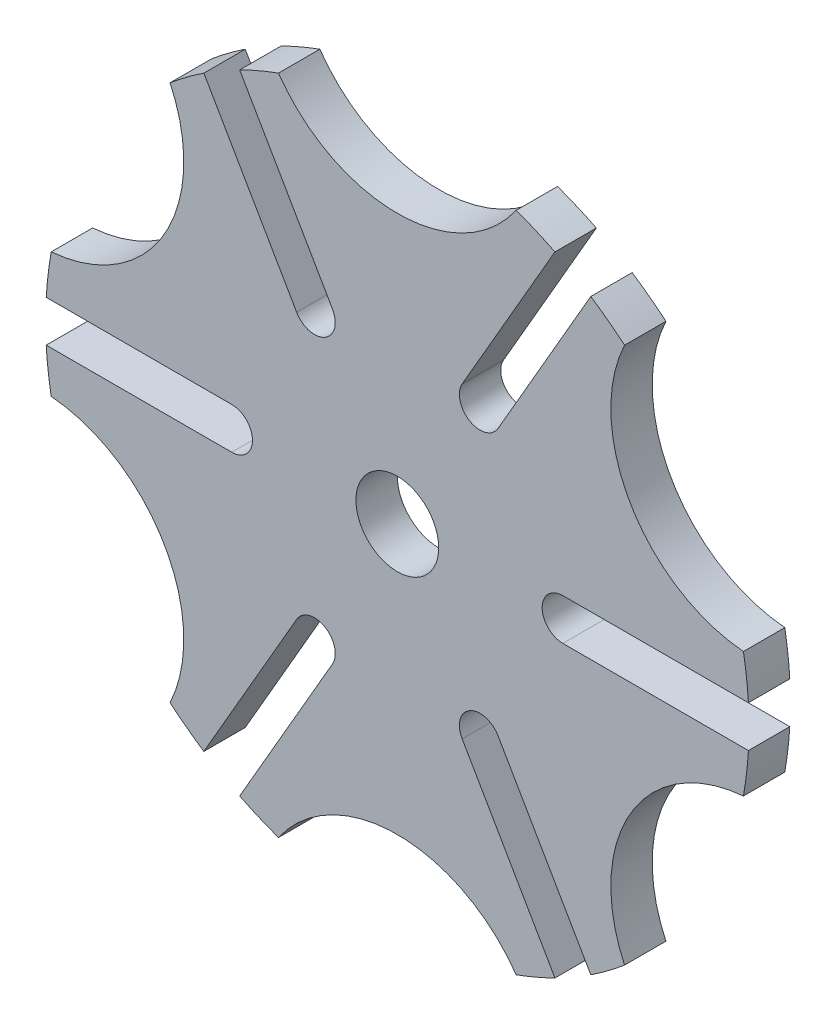
ISO-10303-21;
HEADER;
FILE_DESCRIPTION(('STEP AP214'),'2;1');
FILE_NAME('part.step','',(''),(''),'','','');
FILE_SCHEMA(('AUTOMOTIVE_DESIGN { 1 0 10303 214 1 1 1 1 }'));
ENDSEC;
DATA;
#1=APPLICATION_CONTEXT('core data for automotive mechanical design processes');
#2=APPLICATION_PROTOCOL_DEFINITION('international standard','automotive_design',2000,#1);
#3=PRODUCT_CONTEXT('',#1,'mechanical');
#4=PRODUCT('Part','Part','',(#3));
#5=PRODUCT_RELATED_PRODUCT_CATEGORY('part','',(#4));
#6=PRODUCT_DEFINITION_FORMATION('','',#4);
#7=PRODUCT_DEFINITION_CONTEXT('part definition',#1,'design');
#8=PRODUCT_DEFINITION('design','',#6,#7);
#9=PRODUCT_DEFINITION_SHAPE('','',#8);
#10=(LENGTH_UNIT() NAMED_UNIT(*) SI_UNIT(.MILLI.,.METRE.));
#11=(NAMED_UNIT(*) PLANE_ANGLE_UNIT() SI_UNIT($,.RADIAN.));
#12=(NAMED_UNIT(*) SI_UNIT($,.STERADIAN.) SOLID_ANGLE_UNIT());
#13=UNCERTAINTY_MEASURE_WITH_UNIT(LENGTH_MEASURE(1.E-05),#10,'distance_accuracy_value','');
#14=(GEOMETRIC_REPRESENTATION_CONTEXT(3) GLOBAL_UNCERTAINTY_ASSIGNED_CONTEXT((#13)) GLOBAL_UNIT_ASSIGNED_CONTEXT((#10,
#11,#12)) REPRESENTATION_CONTEXT('',''));
#15=CARTESIAN_POINT('',(0.,0.,0.));
#16=DIRECTION('',(0.,0.,1.));
#17=DIRECTION('',(1.,0.,0.));
#18=AXIS2_PLACEMENT_3D('',#15,#16,#17);
#19=CARTESIAN_POINT('',(0.,0.,10.));
#20=DIRECTION('',(0.,0.,-1.));
#21=DIRECTION('',(-1.,0.,0.));
#22=AXIS2_PLACEMENT_3D('',#19,#20,#21);
#23=CYLINDRICAL_SURFACE('',#22,85.);
#24=CARTESIAN_POINT('',(0.,0.,0.));
#25=DIRECTION('',(0.,0.,1.));
#26=DIRECTION('',(1.,0.,0.));
#27=AXIS2_PLACEMENT_3D('',#24,#25,#26);
#28=CIRCLE('',#27,85.);
#29=CARTESIAN_POINT('',(46.7565338901159,-70.9846922834948,0.));
#30=VERTEX_POINT('',#29);
#31=CARTESIAN_POINT('',(54.9206256864109,-64.8746859276648,0.));
#32=VERTEX_POINT('',#31);
#33=EDGE_CURVE('E287',#30,#32,#28,.T.);
#34=ORIENTED_EDGE('',*,*,#33,.T.);
#35=DIRECTION('',(0.,0.,1.));
#36=VECTOR('',#35,1.);
#37=CARTESIAN_POINT('',(54.9206256864109,-64.8746859276648,5.));
#38=LINE('',#37,#36);
#39=CARTESIAN_POINT('',(54.9206256864109,-64.8746859276648,10.));
#40=VERTEX_POINT('',#39);
#41=EDGE_CURVE('E48',#32,#40,#38,.T.);
#42=ORIENTED_EDGE('',*,*,#41,.T.);
#43=CARTESIAN_POINT('',(0.,0.,10.));
#44=DIRECTION('',(0.,0.,1.));
#45=DIRECTION('',(1.,0.,0.));
#46=AXIS2_PLACEMENT_3D('',#43,#44,#45);
#47=CIRCLE('',#46,85.);
#48=CARTESIAN_POINT('',(46.7565338901159,-70.9846922834948,10.));
#49=VERTEX_POINT('',#48);
#50=EDGE_CURVE('E306',#49,#40,#47,.T.);
#51=ORIENTED_EDGE('',*,*,#50,.F.);
#52=DIRECTION('',(0.,0.,-1.));
#53=VECTOR('',#52,1.);
#54=CARTESIAN_POINT('',(46.7565338901159,-70.9846922834948,10.));
#55=LINE('',#54,#53);
#56=EDGE_CURVE('E411',#49,#30,#55,.T.);
#57=ORIENTED_EDGE('',*,*,#56,.T.);
#58=EDGE_LOOP('',(#34,#42,#51,#57));
#59=FACE_BOUND('',#58,.T.);
#60=ADVANCED_FACE('F33',(#59),#23,.T.);
#61=CARTESIAN_POINT('',(-38.09627985227,-75.9846922834957,0.));
#62=VERTEX_POINT('',#61);
#63=CARTESIAN_POINT('',(-28.7228132326893,-80.0000000000003,0.));
#64=VERTEX_POINT('',#63);
#65=EDGE_CURVE('E292',#62,#64,#28,.T.);
#66=ORIENTED_EDGE('',*,*,#65,.T.);
#67=DIRECTION('',(0.,0.,1.));
#68=VECTOR('',#67,1.);
#69=CARTESIAN_POINT('',(-28.7228132326893,-80.0000000000003,5.));
#70=LINE('',#69,#68);
#71=CARTESIAN_POINT('',(-28.7228132326893,-80.0000000000003,10.));
#72=VERTEX_POINT('',#71);
#73=EDGE_CURVE('E56',#64,#72,#70,.T.);
#74=ORIENTED_EDGE('',*,*,#73,.T.);
#75=CARTESIAN_POINT('',(-38.09627985227,-75.9846922834957,10.));
#76=VERTEX_POINT('',#75);
#77=EDGE_CURVE('E553',#76,#72,#47,.T.);
#78=ORIENTED_EDGE('',*,*,#77,.F.);
#79=DIRECTION('',(0.,0.,-1.));
#80=VECTOR('',#79,1.);
#81=CARTESIAN_POINT('',(-38.09627985227,-75.9846922834957,10.));
#82=LINE('',#81,#80);
#83=EDGE_CURVE('E335',#76,#62,#82,.T.);
#84=ORIENTED_EDGE('',*,*,#83,.T.);
#85=EDGE_LOOP('',(#66,#74,#78,#84));
#86=FACE_BOUND('',#85,.T.);
#87=ADVANCED_FACE('F332',(#86),#23,.T.);
#88=CARTESIAN_POINT('',(-84.8528137423857,-5.,0.));
#89=VERTEX_POINT('',#88);
#90=CARTESIAN_POINT('',(-83.6434389191002,-15.1253140723346,0.));
#91=VERTEX_POINT('',#90);
#92=EDGE_CURVE('E318',#89,#91,#28,.T.);
#93=ORIENTED_EDGE('',*,*,#92,.T.);
#94=DIRECTION('',(0.,0.,1.));
#95=VECTOR('',#94,1.);
#96=CARTESIAN_POINT('',(-83.6434389191002,-15.1253140723346,5.));
#97=LINE('',#96,#95);
#98=CARTESIAN_POINT('',(-83.6434389191002,-15.1253140723346,10.));
#99=VERTEX_POINT('',#98);
#100=EDGE_CURVE('E358',#91,#99,#97,.T.);
#101=ORIENTED_EDGE('',*,*,#100,.T.);
#102=CARTESIAN_POINT('',(-84.8528137423857,-5.,10.));
#103=VERTEX_POINT('',#102);
#104=EDGE_CURVE('E547',#103,#99,#47,.T.);
#105=ORIENTED_EDGE('',*,*,#104,.F.);
#106=DIRECTION('',(0.,0.,-1.));
#107=VECTOR('',#106,1.);
#108=CARTESIAN_POINT('',(-84.8528137423857,-5.,10.));
#109=LINE('',#108,#107);
#110=EDGE_CURVE('E458',#103,#89,#109,.T.);
#111=ORIENTED_EDGE('',*,*,#110,.T.);
#112=EDGE_LOOP('',(#93,#101,#105,#111));
#113=FACE_BOUND('',#112,.T.);
#114=ADVANCED_FACE('F595',(#113),#23,.T.);
#115=CARTESIAN_POINT('',(-46.7565338901154,70.9846922834952,0.));
#116=VERTEX_POINT('',#115);
#117=CARTESIAN_POINT('',(-54.9206256864104,64.8746859276652,0.));
#118=VERTEX_POINT('',#117);
#119=EDGE_CURVE('E311',#116,#118,#28,.T.);
#120=ORIENTED_EDGE('',*,*,#119,.T.);
#121=DIRECTION('',(0.,0.,1.));
#122=VECTOR('',#121,1.);
#123=CARTESIAN_POINT('',(-54.9206256864104,64.8746859276652,5.));
#124=LINE('',#123,#122);
#125=CARTESIAN_POINT('',(-54.9206256864104,64.8746859276652,10.));
#126=VERTEX_POINT('',#125);
#127=EDGE_CURVE('E368',#118,#126,#124,.T.);
#128=ORIENTED_EDGE('',*,*,#127,.T.);
#129=CARTESIAN_POINT('',(-46.7565338901154,70.9846922834952,10.));
#130=VERTEX_POINT('',#129);
#131=EDGE_CURVE('E541',#130,#126,#47,.T.);
#132=ORIENTED_EDGE('',*,*,#131,.F.);
#133=DIRECTION('',(0.,0.,-1.));
#134=VECTOR('',#133,1.);
#135=CARTESIAN_POINT('',(-46.7565338901154,70.9846922834952,10.));
#136=LINE('',#135,#134);
#137=EDGE_CURVE('E482',#130,#116,#136,.T.);
#138=ORIENTED_EDGE('',*,*,#137,.T.);
#139=EDGE_LOOP('',(#120,#128,#132,#138));
#140=FACE_BOUND('',#139,.T.);
#141=ADVANCED_FACE('F637',(#140),#23,.T.);
#142=CARTESIAN_POINT('',(38.0962798522705,75.9846922834954,0.));
#143=VERTEX_POINT('',#142);
#144=CARTESIAN_POINT('',(28.7228132326898,80.0000000000001,0.));
#145=VERTEX_POINT('',#144);
#146=EDGE_CURVE('E301',#143,#145,#28,.T.);
#147=ORIENTED_EDGE('',*,*,#146,.T.);
#148=DIRECTION('',(0.,0.,1.));
#149=VECTOR('',#148,1.);
#150=CARTESIAN_POINT('',(28.7228132326899,80.0000000000001,5.));
#151=LINE('',#150,#149);
#152=CARTESIAN_POINT('',(28.7228132326899,80.0000000000001,10.));
#153=VERTEX_POINT('',#152);
#154=EDGE_CURVE('E378',#145,#153,#151,.T.);
#155=ORIENTED_EDGE('',*,*,#154,.T.);
#156=CARTESIAN_POINT('',(38.0962798522705,75.9846922834954,10.));
#157=VERTEX_POINT('',#156);
#158=EDGE_CURVE('E532',#157,#153,#47,.T.);
#159=ORIENTED_EDGE('',*,*,#158,.F.);
#160=DIRECTION('',(0.,0.,-1.));
#161=VECTOR('',#160,1.);
#162=CARTESIAN_POINT('',(38.0962798522705,75.9846922834954,10.));
#163=LINE('',#162,#161);
#164=EDGE_CURVE('E506',#157,#143,#163,.T.);
#165=ORIENTED_EDGE('',*,*,#164,.T.);
#166=EDGE_LOOP('',(#147,#155,#159,#165));
#167=FACE_BOUND('',#166,.T.);
#168=ADVANCED_FACE('F618',(#167),#23,.T.);
#169=CARTESIAN_POINT('',(84.8528137423857,5.,0.));
#170=VERTEX_POINT('',#169);
#171=CARTESIAN_POINT('',(83.6434389191002,15.1253140723346,0.));
#172=VERTEX_POINT('',#171);
#173=EDGE_CURVE('E291',#170,#172,#28,.T.);
#174=ORIENTED_EDGE('',*,*,#173,.T.);
#175=DIRECTION('',(0.,0.,1.));
#176=VECTOR('',#175,1.);
#177=CARTESIAN_POINT('',(83.6434389191002,15.1253140723346,5.));
#178=LINE('',#177,#176);
#179=CARTESIAN_POINT('',(83.6434389191002,15.1253140723346,10.));
#180=VERTEX_POINT('',#179);
#181=EDGE_CURVE('E388',#172,#180,#178,.T.);
#182=ORIENTED_EDGE('',*,*,#181,.T.);
#183=CARTESIAN_POINT('',(84.8528137423857,5.,10.));
#184=VERTEX_POINT('',#183);
#185=EDGE_CURVE('E308',#184,#180,#47,.T.);
#186=ORIENTED_EDGE('',*,*,#185,.F.);
#187=DIRECTION('',(0.,0.,-1.));
#188=VECTOR('',#187,1.);
#189=CARTESIAN_POINT('',(84.8528137423857,5.,10.));
#190=LINE('',#189,#188);
#191=EDGE_CURVE('E526',#184,#170,#190,.T.);
#192=ORIENTED_EDGE('',*,*,#191,.T.);
#193=EDGE_LOOP('',(#174,#182,#186,#192));
#194=FACE_BOUND('',#193,.T.);
#195=ADVANCED_FACE('F846',(#194),#23,.T.);
#196=CARTESIAN_POINT('',(83.6434389191004,-15.1253140723334,10.));
#197=VERTEX_POINT('',#196);
#198=CARTESIAN_POINT('',(84.8528137423857,-5.,10.));
#199=VERTEX_POINT('',#198);
#200=EDGE_CURVE('E280',#197,#199,#47,.T.);
#201=ORIENTED_EDGE('',*,*,#200,.F.);
#202=DIRECTION('',(0.,0.,1.));
#203=VECTOR('',#202,1.);
#204=CARTESIAN_POINT('',(83.6434389191004,-15.1253140723334,5.));
#205=LINE('',#204,#203);
#206=CARTESIAN_POINT('',(83.6434389191004,-15.1253140723334,0.));
#207=VERTEX_POINT('',#206);
#208=EDGE_CURVE('E266',#197,#207,#205,.F.);
#209=ORIENTED_EDGE('',*,*,#208,.T.);
#210=CARTESIAN_POINT('',(84.8528137423857,-5.,0.));
#211=VERTEX_POINT('',#210);
#212=EDGE_CURVE('E278',#207,#211,#28,.T.);
#213=ORIENTED_EDGE('',*,*,#212,.T.);
#214=DIRECTION('',(0.,0.,-1.));
#215=VECTOR('',#214,1.);
#216=CARTESIAN_POINT('',(84.8528137423857,-5.,10.));
#217=LINE('',#216,#215);
#218=EDGE_CURVE('E523',#211,#199,#217,.F.);
#219=ORIENTED_EDGE('',*,*,#218,.T.);
#220=EDGE_LOOP('',(#201,#209,#213,#219));
#221=FACE_BOUND('',#220,.T.);
#222=ADVANCED_FACE('F276',(#221),#23,.T.);
#223=CARTESIAN_POINT('',(28.722813232691,-79.9999999999997,10.));
#224=VERTEX_POINT('',#223);
#225=CARTESIAN_POINT('',(38.0962798522716,-75.9846922834949,10.));
#226=VERTEX_POINT('',#225);
#227=EDGE_CURVE('E307',#224,#226,#47,.T.);
#228=ORIENTED_EDGE('',*,*,#227,.F.);
#229=DIRECTION('',(0.,0.,1.));
#230=VECTOR('',#229,1.);
#231=CARTESIAN_POINT('',(28.722813232691,-79.9999999999997,5.));
#232=LINE('',#231,#230);
#233=CARTESIAN_POINT('',(28.722813232691,-79.9999999999997,0.));
#234=VERTEX_POINT('',#233);
#235=EDGE_CURVE('E342',#224,#234,#232,.F.);
#236=ORIENTED_EDGE('',*,*,#235,.T.);
#237=CARTESIAN_POINT('',(38.0962798522716,-75.9846922834949,0.));
#238=VERTEX_POINT('',#237);
#239=EDGE_CURVE('E290',#234,#238,#28,.T.);
#240=ORIENTED_EDGE('',*,*,#239,.T.);
#241=DIRECTION('',(0.,0.,-1.));
#242=VECTOR('',#241,1.);
#243=CARTESIAN_POINT('',(38.0962798522716,-75.9846922834949,10.));
#244=LINE('',#243,#242);
#245=EDGE_CURVE('E407',#238,#226,#244,.F.);
#246=ORIENTED_EDGE('',*,*,#245,.T.);
#247=EDGE_LOOP('',(#228,#236,#240,#246));
#248=FACE_BOUND('',#247,.T.);
#249=ADVANCED_FACE('F578',(#248),#23,.T.);
#250=CARTESIAN_POINT('',(-54.9206256864099,-64.8746859276656,10.));
#251=VERTEX_POINT('',#250);
#252=CARTESIAN_POINT('',(-46.7565338901144,-70.9846922834958,10.));
#253=VERTEX_POINT('',#252);
#254=EDGE_CURVE('E551',#251,#253,#47,.T.);
#255=ORIENTED_EDGE('',*,*,#254,.F.);
#256=DIRECTION('',(0.,0.,1.));
#257=VECTOR('',#256,1.);
#258=CARTESIAN_POINT('',(-54.9206256864099,-64.8746859276656,5.));
#259=LINE('',#258,#257);
#260=CARTESIAN_POINT('',(-54.9206256864099,-64.8746859276656,0.));
#261=VERTEX_POINT('',#260);
#262=EDGE_CURVE('E354',#251,#261,#259,.F.);
#263=ORIENTED_EDGE('',*,*,#262,.T.);
#264=CARTESIAN_POINT('',(-46.7565338901144,-70.9846922834958,0.));
#265=VERTEX_POINT('',#264);
#266=EDGE_CURVE('E299',#261,#265,#28,.T.);
#267=ORIENTED_EDGE('',*,*,#266,.T.);
#268=DIRECTION('',(0.,0.,-1.));
#269=VECTOR('',#268,1.);
#270=CARTESIAN_POINT('',(-46.7565338901144,-70.9846922834958,10.));
#271=LINE('',#270,#269);
#272=EDGE_CURVE('E431',#265,#253,#271,.F.);
#273=ORIENTED_EDGE('',*,*,#272,.T.);
#274=EDGE_LOOP('',(#255,#263,#267,#273));
#275=FACE_BOUND('',#274,.T.);
#276=ADVANCED_FACE('F658',(#275),#23,.T.);
#277=CARTESIAN_POINT('',(-83.6434389191003,15.125314072334,10.));
#278=VERTEX_POINT('',#277);
#279=CARTESIAN_POINT('',(-84.8528137423857,5.,10.));
#280=VERTEX_POINT('',#279);
#281=EDGE_CURVE('E545',#278,#280,#47,.T.);
#282=ORIENTED_EDGE('',*,*,#281,.F.);
#283=DIRECTION('',(0.,0.,1.));
#284=VECTOR('',#283,1.);
#285=CARTESIAN_POINT('',(-83.6434389191003,15.125314072334,5.));
#286=LINE('',#285,#284);
#287=CARTESIAN_POINT('',(-83.6434389191003,15.125314072334,0.));
#288=VERTEX_POINT('',#287);
#289=EDGE_CURVE('E364',#278,#288,#286,.F.);
#290=ORIENTED_EDGE('',*,*,#289,.T.);
#291=CARTESIAN_POINT('',(-84.8528137423857,5.,0.));
#292=VERTEX_POINT('',#291);
#293=EDGE_CURVE('E316',#288,#292,#28,.T.);
#294=ORIENTED_EDGE('',*,*,#293,.T.);
#295=DIRECTION('',(0.,0.,-1.));
#296=VECTOR('',#295,1.);
#297=CARTESIAN_POINT('',(-84.8528137423857,5.,10.));
#298=LINE('',#297,#296);
#299=EDGE_CURVE('E454',#292,#280,#298,.F.);
#300=ORIENTED_EDGE('',*,*,#299,.T.);
#301=EDGE_LOOP('',(#282,#290,#294,#300));
#302=FACE_BOUND('',#301,.T.);
#303=ADVANCED_FACE('F604',(#302),#23,.T.);
#304=CARTESIAN_POINT('',(-28.7228132326905,79.9999999999999,10.));
#305=VERTEX_POINT('',#304);
#306=CARTESIAN_POINT('',(-38.096279852271,75.9846922834952,10.));
#307=VERTEX_POINT('',#306);
#308=EDGE_CURVE('E539',#305,#307,#47,.T.);
#309=ORIENTED_EDGE('',*,*,#308,.F.);
#310=DIRECTION('',(0.,0.,1.));
#311=VECTOR('',#310,1.);
#312=CARTESIAN_POINT('',(-28.7228132326905,79.9999999999999,5.));
#313=LINE('',#312,#311);
#314=CARTESIAN_POINT('',(-28.7228132326905,79.9999999999999,0.));
#315=VERTEX_POINT('',#314);
#316=EDGE_CURVE('E374',#305,#315,#313,.F.);
#317=ORIENTED_EDGE('',*,*,#316,.T.);
#318=CARTESIAN_POINT('',(-38.096279852271,75.9846922834952,0.));
#319=VERTEX_POINT('',#318);
#320=EDGE_CURVE('E309',#315,#319,#28,.T.);
#321=ORIENTED_EDGE('',*,*,#320,.T.);
#322=DIRECTION('',(0.,0.,-1.));
#323=VECTOR('',#322,1.);
#324=CARTESIAN_POINT('',(-38.096279852271,75.9846922834952,10.));
#325=LINE('',#324,#323);
#326=EDGE_CURVE('E478',#319,#307,#325,.F.);
#327=ORIENTED_EDGE('',*,*,#326,.T.);
#328=EDGE_LOOP('',(#309,#317,#321,#327));
#329=FACE_BOUND('',#328,.T.);
#330=ADVANCED_FACE('F597',(#329),#23,.T.);
#331=CARTESIAN_POINT('',(54.9206256864099,64.8746859276656,10.));
#332=VERTEX_POINT('',#331);
#333=CARTESIAN_POINT('',(46.7565338901149,70.9846922834955,10.));
#334=VERTEX_POINT('',#333);
#335=EDGE_CURVE('E531',#332,#334,#47,.T.);
#336=ORIENTED_EDGE('',*,*,#335,.F.);
#337=DIRECTION('',(0.,0.,1.));
#338=VECTOR('',#337,1.);
#339=CARTESIAN_POINT('',(54.9206256864099,64.8746859276656,5.));
#340=LINE('',#339,#338);
#341=CARTESIAN_POINT('',(54.9206256864099,64.8746859276656,0.));
#342=VERTEX_POINT('',#341);
#343=EDGE_CURVE('E384',#332,#342,#340,.F.);
#344=ORIENTED_EDGE('',*,*,#343,.T.);
#345=CARTESIAN_POINT('',(46.7565338901149,70.9846922834955,0.));
#346=VERTEX_POINT('',#345);
#347=EDGE_CURVE('E293',#342,#346,#28,.T.);
#348=ORIENTED_EDGE('',*,*,#347,.T.);
#349=DIRECTION('',(0.,0.,-1.));
#350=VECTOR('',#349,1.);
#351=CARTESIAN_POINT('',(46.7565338901149,70.9846922834955,10.));
#352=LINE('',#351,#350);
#353=EDGE_CURVE('E502',#346,#334,#352,.F.);
#354=ORIENTED_EDGE('',*,*,#353,.T.);
#355=EDGE_LOOP('',(#336,#344,#348,#354));
#356=FACE_BOUND('',#355,.T.);
#357=ADVANCED_FACE('F35',(#356),#23,.T.);
#358=CARTESIAN_POINT('',(0.,0.,10.));
#359=DIRECTION('',(0.,0.,1.));
#360=DIRECTION('',(1.,0.,0.));
#361=AXIS2_PLACEMENT_3D('',#358,#359,#360);
#362=PLANE('',#361);
#363=CARTESIAN_POINT('',(86.6025403784445,-49.9999999999989,10.));
#364=DIRECTION('',(0.,0.,1.));
#365=DIRECTION('',(0.50000000000001,-0.866025403784433,0.));
#366=AXIS2_PLACEMENT_3D('',#363,#364,#365);
#367=CIRCLE('',#366,35.);
#368=EDGE_CURVE('E272',#197,#40,#367,.T.);
#369=ORIENTED_EDGE('',*,*,#368,.F.);
#370=ORIENTED_EDGE('',*,*,#200,.T.);
#371=DIRECTION('',(1.,0.,0.));
#372=VECTOR('',#371,1.);
#373=CARTESIAN_POINT('',(40.,-5.,10.));
#374=LINE('',#373,#372);
#375=CARTESIAN_POINT('',(40.,-5.,10.));
#376=VERTEX_POINT('',#375);
#377=EDGE_CURVE('E516',#376,#199,#374,.T.);
#378=ORIENTED_EDGE('',*,*,#377,.F.);
#379=CARTESIAN_POINT('',(40.,0.,10.));
#380=DIRECTION('',(0.,0.,1.));
#381=DIRECTION('',(1.,0.,0.));
#382=AXIS2_PLACEMENT_3D('',#379,#380,#381);
#383=CIRCLE('',#382,5.);
#384=CARTESIAN_POINT('',(40.,5.,10.));
#385=VERTEX_POINT('',#384);
#386=EDGE_CURVE('E508',#385,#376,#383,.T.);
#387=ORIENTED_EDGE('',*,*,#386,.F.);
#388=DIRECTION('',(-1.,0.,0.));
#389=VECTOR('',#388,1.);
#390=CARTESIAN_POINT('',(40.,5.,10.));
#391=LINE('',#390,#389);
#392=EDGE_CURVE('E511',#184,#385,#391,.T.);
#393=ORIENTED_EDGE('',*,*,#392,.F.);
#394=ORIENTED_EDGE('',*,*,#185,.T.);
#395=CARTESIAN_POINT('',(86.6025403784438,50.0000000000001,10.));
#396=DIRECTION('',(0.,0.,1.));
#397=DIRECTION('',(1.,0.,0.));
#398=AXIS2_PLACEMENT_3D('',#395,#396,#397);
#399=CIRCLE('',#398,35.);
#400=EDGE_CURVE('E380',#332,#180,#399,.T.);
#401=ORIENTED_EDGE('',*,*,#400,.F.);
#402=ORIENTED_EDGE('',*,*,#335,.T.);
#403=DIRECTION('',(0.499999999999998,0.86602540378444,0.));
#404=VECTOR('',#403,1.);
#405=CARTESIAN_POINT('',(24.3301270189221,32.1410161513776,10.));
#406=LINE('',#405,#404);
#407=CARTESIAN_POINT('',(24.3301270189221,32.1410161513776,10.));
#408=VERTEX_POINT('',#407);
#409=EDGE_CURVE('E495',#408,#334,#406,.T.);
#410=ORIENTED_EDGE('',*,*,#409,.F.);
#411=CARTESIAN_POINT('',(19.9999999999999,34.6410161513776,10.));
#412=DIRECTION('',(0.,0.,1.));
#413=DIRECTION('',(0.499999999999998,0.86602540378444,0.));
#414=AXIS2_PLACEMENT_3D('',#411,#412,#413);
#415=CIRCLE('',#414,5.);
#416=CARTESIAN_POINT('',(15.6698729810777,37.1410161513776,10.));
#417=VERTEX_POINT('',#416);
#418=EDGE_CURVE('E484',#417,#408,#415,.T.);
#419=ORIENTED_EDGE('',*,*,#418,.F.);
#420=DIRECTION('',(-0.499999999999998,-0.86602540378444,0.));
#421=VECTOR('',#420,1.);
#422=CARTESIAN_POINT('',(15.6698729810777,37.1410161513776,10.));
#423=LINE('',#422,#421);
#424=EDGE_CURVE('E489',#157,#417,#423,.T.);
#425=ORIENTED_EDGE('',*,*,#424,.F.);
#426=ORIENTED_EDGE('',*,*,#158,.T.);
#427=CARTESIAN_POINT('',(-3.7470027081099E-13,100.,10.));
#428=DIRECTION('',(0.,0.,1.));
#429=DIRECTION('',(0.499999999999998,0.86602540378444,0.));
#430=AXIS2_PLACEMENT_3D('',#427,#428,#429);
#431=CIRCLE('',#430,35.);
#432=EDGE_CURVE('E370',#305,#153,#431,.T.);
#433=ORIENTED_EDGE('',*,*,#432,.F.);
#434=ORIENTED_EDGE('',*,*,#308,.T.);
#435=DIRECTION('',(-0.500000000000004,0.866025403784436,0.));
#436=VECTOR('',#435,1.);
#437=CARTESIAN_POINT('',(-15.669872981078,37.1410161513775,10.));
#438=LINE('',#437,#436);
#439=CARTESIAN_POINT('',(-15.669872981078,37.1410161513775,10.));
#440=VERTEX_POINT('',#439);
#441=EDGE_CURVE('E471',#440,#307,#438,.T.);
#442=ORIENTED_EDGE('',*,*,#441,.F.);
#443=CARTESIAN_POINT('',(-20.0000000000002,34.6410161513775,10.));
#444=DIRECTION('',(0.,0.,1.));
#445=DIRECTION('',(-0.500000000000004,0.866025403784436,0.));
#446=AXIS2_PLACEMENT_3D('',#443,#444,#445);
#447=CIRCLE('',#446,5.);
#448=CARTESIAN_POINT('',(-24.3301270189223,32.1410161513774,10.));
#449=VERTEX_POINT('',#448);
#450=EDGE_CURVE('E460',#449,#440,#447,.T.);
#451=ORIENTED_EDGE('',*,*,#450,.F.);
#452=DIRECTION('',(0.500000000000004,-0.866025403784436,0.));
#453=VECTOR('',#452,1.);
#454=CARTESIAN_POINT('',(-24.3301270189223,32.1410161513774,10.));
#455=LINE('',#454,#453);
#456=EDGE_CURVE('E465',#130,#449,#455,.T.);
#457=ORIENTED_EDGE('',*,*,#456,.F.);
#458=ORIENTED_EDGE('',*,*,#131,.T.);
#459=CARTESIAN_POINT('',(-86.6025403784442,49.9999999999995,10.));
#460=DIRECTION('',(0.,0.,1.));
#461=DIRECTION('',(-0.500000000000004,0.866025403784436,0.));
#462=AXIS2_PLACEMENT_3D('',#459,#460,#461);
#463=CIRCLE('',#462,35.);
#464=EDGE_CURVE('E360',#278,#126,#463,.T.);
#465=ORIENTED_EDGE('',*,*,#464,.F.);
#466=ORIENTED_EDGE('',*,*,#281,.T.);
#467=DIRECTION('',(-1.,0.,0.));
#468=VECTOR('',#467,1.);
#469=CARTESIAN_POINT('',(-40.,5.,10.));
#470=LINE('',#469,#468);
#471=CARTESIAN_POINT('',(-40.,5.,10.));
#472=VERTEX_POINT('',#471);
#473=EDGE_CURVE('E447',#472,#280,#470,.T.);
#474=ORIENTED_EDGE('',*,*,#473,.F.);
#475=CARTESIAN_POINT('',(-40.,0.,10.));
#476=DIRECTION('',(0.,0.,1.));
#477=DIRECTION('',(-1.,0.,0.));
#478=AXIS2_PLACEMENT_3D('',#475,#476,#477);
#479=CIRCLE('',#478,5.);
#480=CARTESIAN_POINT('',(-40.,-5.,10.));
#481=VERTEX_POINT('',#480);
#482=EDGE_CURVE('E436',#481,#472,#479,.T.);
#483=ORIENTED_EDGE('',*,*,#482,.F.);
#484=DIRECTION('',(1.,0.,0.));
#485=VECTOR('',#484,1.);
#486=CARTESIAN_POINT('',(-40.,-5.,10.));
#487=LINE('',#486,#485);
#488=EDGE_CURVE('E441',#103,#481,#487,.T.);
#489=ORIENTED_EDGE('',*,*,#488,.F.);
#490=ORIENTED_EDGE('',*,*,#104,.T.);
#491=CARTESIAN_POINT('',(-86.6025403784438,-50.0000000000001,10.));
#492=DIRECTION('',(0.,0.,1.));
#493=DIRECTION('',(-1.,0.,0.));
#494=AXIS2_PLACEMENT_3D('',#491,#492,#493);
#495=CIRCLE('',#494,35.);
#496=EDGE_CURVE('E350',#251,#99,#495,.T.);
#497=ORIENTED_EDGE('',*,*,#496,.F.);
#498=ORIENTED_EDGE('',*,*,#254,.T.);
#499=DIRECTION('',(-0.499999999999992,-0.866025403784443,0.));
#500=VECTOR('',#499,1.);
#501=CARTESIAN_POINT('',(-24.3301270189219,-32.1410161513778,10.));
#502=LINE('',#501,#500);
#503=CARTESIAN_POINT('',(-24.3301270189219,-32.1410161513778,10.));
#504=VERTEX_POINT('',#503);
#505=EDGE_CURVE('E424',#504,#253,#502,.T.);
#506=ORIENTED_EDGE('',*,*,#505,.F.);
#507=CARTESIAN_POINT('',(-19.9999999999997,-34.6410161513777,10.));
#508=DIRECTION('',(0.,0.,1.));
#509=DIRECTION('',(-0.499999999999992,-0.866025403784443,0.));
#510=AXIS2_PLACEMENT_3D('',#507,#508,#509);
#511=CIRCLE('',#510,5.);
#512=CARTESIAN_POINT('',(-15.6698729810775,-37.1410161513777,10.));
#513=VERTEX_POINT('',#512);
#514=EDGE_CURVE('E414',#513,#504,#511,.T.);
#515=ORIENTED_EDGE('',*,*,#514,.F.);
#516=DIRECTION('',(0.499999999999992,0.866025403784443,0.));
#517=VECTOR('',#516,1.);
#518=CARTESIAN_POINT('',(-15.6698729810775,-37.1410161513777,10.));
#519=LINE('',#518,#517);
#520=EDGE_CURVE('E418',#76,#513,#519,.T.);
#521=ORIENTED_EDGE('',*,*,#520,.F.);
#522=ORIENTED_EDGE('',*,*,#77,.T.);
#523=CARTESIAN_POINT('',(1.06858966120171E-12,-100.,10.));
#524=DIRECTION('',(0.,0.,1.));
#525=DIRECTION('',(-0.499999999999992,-0.866025403784443,0.));
#526=AXIS2_PLACEMENT_3D('',#523,#524,#525);
#527=CIRCLE('',#526,35.);
#528=EDGE_CURVE('E343',#224,#72,#527,.T.);
#529=ORIENTED_EDGE('',*,*,#528,.F.);
#530=ORIENTED_EDGE('',*,*,#227,.T.);
#531=DIRECTION('',(0.50000000000001,-0.866025403784433,0.));
#532=VECTOR('',#531,1.);
#533=CARTESIAN_POINT('',(15.6698729810782,-37.1410161513774,10.));
#534=LINE('',#533,#532);
#535=CARTESIAN_POINT('',(15.6698729810782,-37.1410161513774,10.));
#536=VERTEX_POINT('',#535);
#537=EDGE_CURVE('E400',#536,#226,#534,.T.);
#538=ORIENTED_EDGE('',*,*,#537,.F.);
#539=CARTESIAN_POINT('',(20.0000000000004,-34.6410161513773,10.));
#540=DIRECTION('',(0.,0.,1.));
#541=DIRECTION('',(0.50000000000001,-0.866025403784433,0.));
#542=AXIS2_PLACEMENT_3D('',#539,#540,#541);
#543=CIRCLE('',#542,5.);
#544=CARTESIAN_POINT('',(24.3301270189226,-32.1410161513773,10.));
#545=VERTEX_POINT('',#544);
#546=EDGE_CURVE('E390',#545,#536,#543,.T.);
#547=ORIENTED_EDGE('',*,*,#546,.F.);
#548=DIRECTION('',(-0.50000000000001,0.866025403784433,0.));
#549=VECTOR('',#548,1.);
#550=CARTESIAN_POINT('',(24.3301270189226,-32.1410161513773,10.));
#551=LINE('',#550,#549);
#552=EDGE_CURVE('E395',#49,#545,#551,.T.);
#553=ORIENTED_EDGE('',*,*,#552,.F.);
#554=ORIENTED_EDGE('',*,*,#50,.T.);
#555=EDGE_LOOP('',(#369,#370,#378,#387,#393,#394,#401,#402,#410,#419,#425,#426,#433,#434,#442,
#451,#457,#458,#465,#466,#474,#483,#489,#490,#497,#498,#506,#515,#521,#522,#529,#530,#538,#547,
#553,#554));
#556=FACE_BOUND('',#555,.T.);
#557=CARTESIAN_POINT('',(0.,0.,10.));
#558=DIRECTION('',(0.,0.,1.));
#559=DIRECTION('',(1.,0.,0.));
#560=AXIS2_PLACEMENT_3D('',#557,#558,#559);
#561=CIRCLE('',#560,10.);
#562=CARTESIAN_POINT('',(10.,0.,10.));
#563=VERTEX_POINT('',#562);
#564=EDGE_CURVE('E295',#563,#563,#561,.T.);
#565=ORIENTED_EDGE('',*,*,#564,.F.);
#566=EDGE_LOOP('',(#565));
#567=FACE_BOUND('',#566,.T.);
#568=ADVANCED_FACE('F562',(#556,#567),#362,.T.);
#569=CARTESIAN_POINT('',(0.,0.,0.));
#570=DIRECTION('',(0.,0.,1.));
#571=DIRECTION('',(1.,0.,0.));
#572=AXIS2_PLACEMENT_3D('',#569,#570,#571);
#573=PLANE('',#572);
#574=CARTESIAN_POINT('',(0.,0.,0.));
#575=DIRECTION('',(0.,0.,1.));
#576=DIRECTION('',(1.,0.,0.));
#577=AXIS2_PLACEMENT_3D('',#574,#575,#576);
#578=CIRCLE('',#577,10.);
#579=CARTESIAN_POINT('',(10.,0.,0.));
#580=VERTEX_POINT('',#579);
#581=EDGE_CURVE('E288',#580,#580,#578,.T.);
#582=ORIENTED_EDGE('',*,*,#581,.T.);
#583=EDGE_LOOP('',(#582));
#584=FACE_BOUND('',#583,.T.);
#585=ORIENTED_EDGE('',*,*,#212,.F.);
#586=CARTESIAN_POINT('',(86.6025403784445,-49.9999999999989,0.));
#587=DIRECTION('',(0.,0.,1.));
#588=DIRECTION('',(0.50000000000001,-0.866025403784433,0.));
#589=AXIS2_PLACEMENT_3D('',#586,#587,#588);
#590=CIRCLE('',#589,35.);
#591=EDGE_CURVE('E263',#207,#32,#590,.T.);
#592=ORIENTED_EDGE('',*,*,#591,.T.);
#593=ORIENTED_EDGE('',*,*,#33,.F.);
#594=DIRECTION('',(-0.50000000000001,0.866025403784433,0.));
#595=VECTOR('',#594,1.);
#596=CARTESIAN_POINT('',(4.33012701892216,2.50000000000005,0.));
#597=LINE('',#596,#595);
#598=CARTESIAN_POINT('',(24.3301270189226,-32.1410161513773,0.));
#599=VERTEX_POINT('',#598);
#600=EDGE_CURVE('E11',#30,#599,#597,.T.);
#601=ORIENTED_EDGE('',*,*,#600,.T.);
#602=CARTESIAN_POINT('',(20.0000000000004,-34.6410161513773,0.));
#603=DIRECTION('',(0.,0.,1.));
#604=DIRECTION('',(0.50000000000001,-0.866025403784433,0.));
#605=AXIS2_PLACEMENT_3D('',#602,#603,#604);
#606=CIRCLE('',#605,5.);
#607=CARTESIAN_POINT('',(15.6698729810782,-37.1410161513774,0.));
#608=VERTEX_POINT('',#607);
#609=EDGE_CURVE('E391',#599,#608,#606,.T.);
#610=ORIENTED_EDGE('',*,*,#609,.T.);
#611=DIRECTION('',(0.50000000000001,-0.866025403784433,0.));
#612=VECTOR('',#611,1.);
#613=CARTESIAN_POINT('',(15.6698729810782,-37.1410161513774,0.));
#614=LINE('',#613,#612);
#615=EDGE_CURVE('E394',#608,#238,#614,.T.);
#616=ORIENTED_EDGE('',*,*,#615,.T.);
#617=ORIENTED_EDGE('',*,*,#239,.F.);
#618=CARTESIAN_POINT('',(1.06858966120171E-12,-100.,0.));
#619=DIRECTION('',(0.,0.,1.));
#620=DIRECTION('',(-0.499999999999992,-0.866025403784443,0.));
#621=AXIS2_PLACEMENT_3D('',#618,#619,#620);
#622=CIRCLE('',#621,35.);
#623=EDGE_CURVE('E339',#234,#64,#622,.T.);
#624=ORIENTED_EDGE('',*,*,#623,.T.);
#625=ORIENTED_EDGE('',*,*,#65,.F.);
#626=DIRECTION('',(0.499999999999992,0.866025403784443,0.));
#627=VECTOR('',#626,1.);
#628=CARTESIAN_POINT('',(4.33012701892222,-2.49999999999996,0.));
#629=LINE('',#628,#627);
#630=CARTESIAN_POINT('',(-15.6698729810775,-37.1410161513777,0.));
#631=VERTEX_POINT('',#630);
#632=EDGE_CURVE('E41',#62,#631,#629,.T.);
#633=ORIENTED_EDGE('',*,*,#632,.T.);
#634=CARTESIAN_POINT('',(-19.9999999999997,-34.6410161513777,0.));
#635=DIRECTION('',(0.,0.,1.));
#636=DIRECTION('',(-0.499999999999992,-0.866025403784443,0.));
#637=AXIS2_PLACEMENT_3D('',#634,#635,#636);
#638=CIRCLE('',#637,5.);
#639=CARTESIAN_POINT('',(-24.3301270189219,-32.1410161513778,0.));
#640=VERTEX_POINT('',#639);
#641=EDGE_CURVE('E415',#631,#640,#638,.T.);
#642=ORIENTED_EDGE('',*,*,#641,.T.);
#643=DIRECTION('',(-0.499999999999992,-0.866025403784443,0.));
#644=VECTOR('',#643,1.);
#645=CARTESIAN_POINT('',(-24.3301270189219,-32.1410161513778,0.));
#646=LINE('',#645,#644);
#647=EDGE_CURVE('E417',#640,#265,#646,.T.);
#648=ORIENTED_EDGE('',*,*,#647,.T.);
#649=ORIENTED_EDGE('',*,*,#266,.F.);
#650=CARTESIAN_POINT('',(-86.6025403784438,-50.0000000000001,0.));
#651=DIRECTION('',(0.,0.,1.));
#652=DIRECTION('',(-1.,0.,0.));
#653=AXIS2_PLACEMENT_3D('',#650,#651,#652);
#654=CIRCLE('',#653,35.);
#655=EDGE_CURVE('E351',#261,#91,#654,.T.);
#656=ORIENTED_EDGE('',*,*,#655,.T.);
#657=ORIENTED_EDGE('',*,*,#92,.F.);
#658=DIRECTION('',(1.,0.,0.));
#659=VECTOR('',#658,1.);
#660=CARTESIAN_POINT('',(0.,-5.,0.));
#661=LINE('',#660,#659);
#662=CARTESIAN_POINT('',(-40.,-5.,0.));
#663=VERTEX_POINT('',#662);
#664=EDGE_CURVE('E668',#89,#663,#661,.T.);
#665=ORIENTED_EDGE('',*,*,#664,.T.);
#666=CARTESIAN_POINT('',(-40.,0.,0.));
#667=DIRECTION('',(0.,0.,1.));
#668=DIRECTION('',(-1.,0.,0.));
#669=AXIS2_PLACEMENT_3D('',#666,#667,#668);
#670=CIRCLE('',#669,5.);
#671=CARTESIAN_POINT('',(-40.,5.,0.));
#672=VERTEX_POINT('',#671);
#673=EDGE_CURVE('E437',#663,#672,#670,.T.);
#674=ORIENTED_EDGE('',*,*,#673,.T.);
#675=DIRECTION('',(-1.,0.,0.));
#676=VECTOR('',#675,1.);
#677=CARTESIAN_POINT('',(-40.,5.,0.));
#678=LINE('',#677,#676);
#679=EDGE_CURVE('E440',#672,#292,#678,.T.);
#680=ORIENTED_EDGE('',*,*,#679,.T.);
#681=ORIENTED_EDGE('',*,*,#293,.F.);
#682=CARTESIAN_POINT('',(-86.6025403784442,49.9999999999995,0.));
#683=DIRECTION('',(0.,0.,1.));
#684=DIRECTION('',(-0.500000000000004,0.866025403784436,0.));
#685=AXIS2_PLACEMENT_3D('',#682,#683,#684);
#686=CIRCLE('',#685,35.);
#687=EDGE_CURVE('E361',#288,#118,#686,.T.);
#688=ORIENTED_EDGE('',*,*,#687,.T.);
#689=ORIENTED_EDGE('',*,*,#119,.F.);
#690=DIRECTION('',(0.500000000000004,-0.866025403784436,0.));
#691=VECTOR('',#690,1.);
#692=CARTESIAN_POINT('',(-4.33012701892218,-2.50000000000002,0.));
#693=LINE('',#692,#691);
#694=CARTESIAN_POINT('',(-24.3301270189223,32.1410161513774,0.));
#695=VERTEX_POINT('',#694);
#696=EDGE_CURVE('E636',#116,#695,#693,.T.);
#697=ORIENTED_EDGE('',*,*,#696,.T.);
#698=CARTESIAN_POINT('',(-20.0000000000002,34.6410161513775,0.));
#699=DIRECTION('',(0.,0.,1.));
#700=DIRECTION('',(-0.500000000000004,0.866025403784436,0.));
#701=AXIS2_PLACEMENT_3D('',#698,#699,#700);
#702=CIRCLE('',#701,5.);
#703=CARTESIAN_POINT('',(-15.669872981078,37.1410161513775,0.));
#704=VERTEX_POINT('',#703);
#705=EDGE_CURVE('E461',#695,#704,#702,.T.);
#706=ORIENTED_EDGE('',*,*,#705,.T.);
#707=DIRECTION('',(-0.500000000000004,0.866025403784436,0.));
#708=VECTOR('',#707,1.);
#709=CARTESIAN_POINT('',(-15.669872981078,37.1410161513775,0.));
#710=LINE('',#709,#708);
#711=EDGE_CURVE('E464',#704,#319,#710,.T.);
#712=ORIENTED_EDGE('',*,*,#711,.T.);
#713=ORIENTED_EDGE('',*,*,#320,.F.);
#714=CARTESIAN_POINT('',(-3.7470027081099E-13,100.,0.));
#715=DIRECTION('',(0.,0.,1.));
#716=DIRECTION('',(0.499999999999998,0.86602540378444,0.));
#717=AXIS2_PLACEMENT_3D('',#714,#715,#716);
#718=CIRCLE('',#717,35.);
#719=EDGE_CURVE('E371',#315,#145,#718,.T.);
#720=ORIENTED_EDGE('',*,*,#719,.T.);
#721=ORIENTED_EDGE('',*,*,#146,.F.);
#722=DIRECTION('',(-0.499999999999998,-0.86602540378444,0.));
#723=VECTOR('',#722,1.);
#724=CARTESIAN_POINT('',(-4.3301270189222,2.49999999999999,0.));
#725=LINE('',#724,#723);
#726=CARTESIAN_POINT('',(15.6698729810777,37.1410161513776,0.));
#727=VERTEX_POINT('',#726);
#728=EDGE_CURVE('E538',#143,#727,#725,.T.);
#729=ORIENTED_EDGE('',*,*,#728,.T.);
#730=CARTESIAN_POINT('',(19.9999999999999,34.6410161513776,0.));
#731=DIRECTION('',(0.,0.,1.));
#732=DIRECTION('',(0.499999999999998,0.86602540378444,0.));
#733=AXIS2_PLACEMENT_3D('',#730,#731,#732);
#734=CIRCLE('',#733,5.);
#735=CARTESIAN_POINT('',(24.3301270189221,32.1410161513776,0.));
#736=VERTEX_POINT('',#735);
#737=EDGE_CURVE('E485',#727,#736,#734,.T.);
#738=ORIENTED_EDGE('',*,*,#737,.T.);
#739=DIRECTION('',(0.499999999999998,0.86602540378444,0.));
#740=VECTOR('',#739,1.);
#741=CARTESIAN_POINT('',(24.3301270189221,32.1410161513776,0.));
#742=LINE('',#741,#740);
#743=EDGE_CURVE('E488',#736,#346,#742,.T.);
#744=ORIENTED_EDGE('',*,*,#743,.T.);
#745=ORIENTED_EDGE('',*,*,#347,.F.);
#746=CARTESIAN_POINT('',(86.6025403784438,50.0000000000001,0.));
#747=DIRECTION('',(0.,0.,1.));
#748=DIRECTION('',(1.,0.,0.));
#749=AXIS2_PLACEMENT_3D('',#746,#747,#748);
#750=CIRCLE('',#749,35.);
#751=EDGE_CURVE('E381',#342,#172,#750,.T.);
#752=ORIENTED_EDGE('',*,*,#751,.T.);
#753=ORIENTED_EDGE('',*,*,#173,.F.);
#754=DIRECTION('',(-1.,0.,0.));
#755=VECTOR('',#754,1.);
#756=CARTESIAN_POINT('',(0.,5.,0.));
#757=LINE('',#756,#755);
#758=CARTESIAN_POINT('',(40.,5.,0.));
#759=VERTEX_POINT('',#758);
#760=EDGE_CURVE('E530',#170,#759,#757,.T.);
#761=ORIENTED_EDGE('',*,*,#760,.T.);
#762=CARTESIAN_POINT('',(40.,0.,0.));
#763=DIRECTION('',(0.,0.,1.));
#764=DIRECTION('',(1.,0.,0.));
#765=AXIS2_PLACEMENT_3D('',#762,#763,#764);
#766=CIRCLE('',#765,5.);
#767=CARTESIAN_POINT('',(40.,-5.,0.));
#768=VERTEX_POINT('',#767);
#769=EDGE_CURVE('E509',#759,#768,#766,.T.);
#770=ORIENTED_EDGE('',*,*,#769,.T.);
#771=DIRECTION('',(1.,0.,0.));
#772=VECTOR('',#771,1.);
#773=CARTESIAN_POINT('',(40.,-5.,0.));
#774=LINE('',#773,#772);
#775=EDGE_CURVE('E286',#768,#211,#774,.T.);
#776=ORIENTED_EDGE('',*,*,#775,.T.);
#777=EDGE_LOOP('',(#585,#592,#593,#601,#610,#616,#617,#624,#625,#633,#642,#648,#649,#656,#657,
#665,#674,#680,#681,#688,#689,#697,#706,#712,#713,#720,#721,#729,#738,#744,#745,#752,#753,#761,
#770,#776));
#778=FACE_BOUND('',#777,.T.);
#779=ADVANCED_FACE('F283',(#584,#778),#573,.F.);
#780=CARTESIAN_POINT('',(0.,0.,0.));
#781=DIRECTION('',(0.,0.,1.));
#782=DIRECTION('',(1.,0.,0.));
#783=AXIS2_PLACEMENT_3D('',#780,#781,#782);
#784=CYLINDRICAL_SURFACE('',#783,10.);
#785=ORIENTED_EDGE('',*,*,#581,.F.);
#786=EDGE_LOOP('',(#785));
#787=FACE_BOUND('',#786,.T.);
#788=ORIENTED_EDGE('',*,*,#564,.T.);
#789=EDGE_LOOP('',(#788));
#790=FACE_BOUND('',#789,.T.);
#791=ADVANCED_FACE('F692',(#787,#790),#784,.F.);
#792=CARTESIAN_POINT('',(40.,5.,0.));
#793=DIRECTION('',(0.,1.,0.));
#794=DIRECTION('',(0.,0.,1.));
#795=AXIS2_PLACEMENT_3D('',#792,#793,#794);
#796=PLANE('',#795);
#797=ORIENTED_EDGE('',*,*,#392,.T.);
#798=DIRECTION('',(0.,0.,1.));
#799=VECTOR('',#798,1.);
#800=CARTESIAN_POINT('',(40.,5.,0.));
#801=LINE('',#800,#799);
#802=EDGE_CURVE('E520',#759,#385,#801,.T.);
#803=ORIENTED_EDGE('',*,*,#802,.F.);
#804=ORIENTED_EDGE('',*,*,#760,.F.);
#805=ORIENTED_EDGE('',*,*,#191,.F.);
#806=EDGE_LOOP('',(#797,#803,#804,#805));
#807=FACE_BOUND('',#806,.T.);
#808=ADVANCED_FACE('F689',(#807),#796,.F.);
#809=CARTESIAN_POINT('',(40.,-5.,0.));
#810=DIRECTION('',(0.,-1.,0.));
#811=DIRECTION('',(0.,0.,-1.));
#812=AXIS2_PLACEMENT_3D('',#809,#810,#811);
#813=PLANE('',#812);
#814=ORIENTED_EDGE('',*,*,#775,.F.);
#815=DIRECTION('',(0.,0.,1.));
#816=VECTOR('',#815,1.);
#817=CARTESIAN_POINT('',(40.,-5.,0.));
#818=LINE('',#817,#816);
#819=EDGE_CURVE('E513',#768,#376,#818,.T.);
#820=ORIENTED_EDGE('',*,*,#819,.T.);
#821=ORIENTED_EDGE('',*,*,#377,.T.);
#822=ORIENTED_EDGE('',*,*,#218,.F.);
#823=EDGE_LOOP('',(#814,#820,#821,#822));
#824=FACE_BOUND('',#823,.T.);
#825=ADVANCED_FACE('F681',(#824),#813,.F.);
#826=CARTESIAN_POINT('',(40.,0.,0.));
#827=DIRECTION('',(0.,0.,1.));
#828=DIRECTION('',(1.,0.,0.));
#829=AXIS2_PLACEMENT_3D('',#826,#827,#828);
#830=CYLINDRICAL_SURFACE('',#829,5.);
#831=ORIENTED_EDGE('',*,*,#386,.T.);
#832=ORIENTED_EDGE('',*,*,#819,.F.);
#833=ORIENTED_EDGE('',*,*,#769,.F.);
#834=ORIENTED_EDGE('',*,*,#802,.T.);
#835=EDGE_LOOP('',(#831,#832,#833,#834));
#836=FACE_BOUND('',#835,.T.);
#837=ADVANCED_FACE('F674',(#836),#830,.F.);
#838=CARTESIAN_POINT('',(15.6698729810777,37.1410161513776,0.));
#839=DIRECTION('',(-0.86602540378444,0.499999999999998,0.));
#840=DIRECTION('',(-0.499999999999998,-0.86602540378444,0.));
#841=AXIS2_PLACEMENT_3D('',#838,#839,#840);
#842=PLANE('',#841);
#843=ORIENTED_EDGE('',*,*,#424,.T.);
#844=DIRECTION('',(0.,0.,1.));
#845=VECTOR('',#844,1.);
#846=CARTESIAN_POINT('',(15.6698729810777,37.1410161513776,0.));
#847=LINE('',#846,#845);
#848=EDGE_CURVE('E499',#727,#417,#847,.T.);
#849=ORIENTED_EDGE('',*,*,#848,.F.);
#850=ORIENTED_EDGE('',*,*,#728,.F.);
#851=ORIENTED_EDGE('',*,*,#164,.F.);
#852=EDGE_LOOP('',(#843,#849,#850,#851));
#853=FACE_BOUND('',#852,.T.);
#854=ADVANCED_FACE('F672',(#853),#842,.F.);
#855=CARTESIAN_POINT('',(24.3301270189221,32.1410161513776,0.));
#856=DIRECTION('',(0.86602540378444,-0.499999999999998,0.));
#857=DIRECTION('',(0.499999999999998,0.86602540378444,0.));
#858=AXIS2_PLACEMENT_3D('',#855,#856,#857);
#859=PLANE('',#858);
#860=ORIENTED_EDGE('',*,*,#743,.F.);
#861=DIRECTION('',(0.,0.,1.));
#862=VECTOR('',#861,1.);
#863=CARTESIAN_POINT('',(24.3301270189221,32.1410161513776,0.));
#864=LINE('',#863,#862);
#865=EDGE_CURVE('E492',#736,#408,#864,.T.);
#866=ORIENTED_EDGE('',*,*,#865,.T.);
#867=ORIENTED_EDGE('',*,*,#409,.T.);
#868=ORIENTED_EDGE('',*,*,#353,.F.);
#869=EDGE_LOOP('',(#860,#866,#867,#868));
#870=FACE_BOUND('',#869,.T.);
#871=ADVANCED_FACE('F613',(#870),#859,.F.);
#872=CARTESIAN_POINT('',(19.9999999999999,34.6410161513776,0.));
#873=DIRECTION('',(0.,0.,1.));
#874=DIRECTION('',(1.,0.,0.));
#875=AXIS2_PLACEMENT_3D('',#872,#873,#874);
#876=CYLINDRICAL_SURFACE('',#875,5.);
#877=ORIENTED_EDGE('',*,*,#418,.T.);
#878=ORIENTED_EDGE('',*,*,#865,.F.);
#879=ORIENTED_EDGE('',*,*,#737,.F.);
#880=ORIENTED_EDGE('',*,*,#848,.T.);
#881=EDGE_LOOP('',(#877,#878,#879,#880));
#882=FACE_BOUND('',#881,.T.);
#883=ADVANCED_FACE('F616',(#882),#876,.F.);
#884=CARTESIAN_POINT('',(-24.3301270189223,32.1410161513774,0.));
#885=DIRECTION('',(-0.866025403784436,-0.500000000000004,0.));
#886=DIRECTION('',(0.500000000000004,-0.866025403784436,0.));
#887=AXIS2_PLACEMENT_3D('',#884,#885,#886);
#888=PLANE('',#887);
#889=ORIENTED_EDGE('',*,*,#456,.T.);
#890=DIRECTION('',(0.,0.,1.));
#891=VECTOR('',#890,1.);
#892=CARTESIAN_POINT('',(-24.3301270189223,32.1410161513774,0.));
#893=LINE('',#892,#891);
#894=EDGE_CURVE('E475',#695,#449,#893,.T.);
#895=ORIENTED_EDGE('',*,*,#894,.F.);
#896=ORIENTED_EDGE('',*,*,#696,.F.);
#897=ORIENTED_EDGE('',*,*,#137,.F.);
#898=EDGE_LOOP('',(#889,#895,#896,#897));
#899=FACE_BOUND('',#898,.T.);
#900=ADVANCED_FACE('F635',(#899),#888,.F.);
#901=CARTESIAN_POINT('',(-15.669872981078,37.1410161513775,0.));
#902=DIRECTION('',(0.866025403784436,0.500000000000004,0.));
#903=DIRECTION('',(-0.500000000000004,0.866025403784436,0.));
#904=AXIS2_PLACEMENT_3D('',#901,#902,#903);
#905=PLANE('',#904);
#906=ORIENTED_EDGE('',*,*,#711,.F.);
#907=DIRECTION('',(0.,0.,1.));
#908=VECTOR('',#907,1.);
#909=CARTESIAN_POINT('',(-15.669872981078,37.1410161513775,0.));
#910=LINE('',#909,#908);
#911=EDGE_CURVE('E468',#704,#440,#910,.T.);
#912=ORIENTED_EDGE('',*,*,#911,.T.);
#913=ORIENTED_EDGE('',*,*,#441,.T.);
#914=ORIENTED_EDGE('',*,*,#326,.F.);
#915=EDGE_LOOP('',(#906,#912,#913,#914));
#916=FACE_BOUND('',#915,.T.);
#917=ADVANCED_FACE('F627',(#916),#905,.F.);
#918=CARTESIAN_POINT('',(-20.0000000000002,34.6410161513775,0.));
#919=DIRECTION('',(0.,0.,1.));
#920=DIRECTION('',(1.,0.,0.));
#921=AXIS2_PLACEMENT_3D('',#918,#919,#920);
#922=CYLINDRICAL_SURFACE('',#921,5.);
#923=ORIENTED_EDGE('',*,*,#450,.T.);
#924=ORIENTED_EDGE('',*,*,#911,.F.);
#925=ORIENTED_EDGE('',*,*,#705,.F.);
#926=ORIENTED_EDGE('',*,*,#894,.T.);
#927=EDGE_LOOP('',(#923,#924,#925,#926));
#928=FACE_BOUND('',#927,.T.);
#929=ADVANCED_FACE('F631',(#928),#922,.F.);
#930=CARTESIAN_POINT('',(-40.,-5.,0.));
#931=DIRECTION('',(0.,-1.,0.));
#932=DIRECTION('',(0.,0.,-1.));
#933=AXIS2_PLACEMENT_3D('',#930,#931,#932);
#934=PLANE('',#933);
#935=ORIENTED_EDGE('',*,*,#488,.T.);
#936=DIRECTION('',(0.,0.,1.));
#937=VECTOR('',#936,1.);
#938=CARTESIAN_POINT('',(-40.,-5.,0.));
#939=LINE('',#938,#937);
#940=EDGE_CURVE('E451',#663,#481,#939,.T.);
#941=ORIENTED_EDGE('',*,*,#940,.F.);
#942=ORIENTED_EDGE('',*,*,#664,.F.);
#943=ORIENTED_EDGE('',*,*,#110,.F.);
#944=EDGE_LOOP('',(#935,#941,#942,#943));
#945=FACE_BOUND('',#944,.T.);
#946=ADVANCED_FACE('F767',(#945),#934,.F.);
#947=CARTESIAN_POINT('',(-40.,5.,0.));
#948=DIRECTION('',(0.,1.,0.));
#949=DIRECTION('',(0.,0.,1.));
#950=AXIS2_PLACEMENT_3D('',#947,#948,#949);
#951=PLANE('',#950);
#952=ORIENTED_EDGE('',*,*,#679,.F.);
#953=DIRECTION('',(0.,0.,1.));
#954=VECTOR('',#953,1.);
#955=CARTESIAN_POINT('',(-40.,5.,0.));
#956=LINE('',#955,#954);
#957=EDGE_CURVE('E444',#672,#472,#956,.T.);
#958=ORIENTED_EDGE('',*,*,#957,.T.);
#959=ORIENTED_EDGE('',*,*,#473,.T.);
#960=ORIENTED_EDGE('',*,*,#299,.F.);
#961=EDGE_LOOP('',(#952,#958,#959,#960));
#962=FACE_BOUND('',#961,.T.);
#963=ADVANCED_FACE('F647',(#962),#951,.F.);
#964=CARTESIAN_POINT('',(-40.,0.,0.));
#965=DIRECTION('',(0.,0.,1.));
#966=DIRECTION('',(1.,0.,0.));
#967=AXIS2_PLACEMENT_3D('',#964,#965,#966);
#968=CYLINDRICAL_SURFACE('',#967,5.);
#969=ORIENTED_EDGE('',*,*,#482,.T.);
#970=ORIENTED_EDGE('',*,*,#957,.F.);
#971=ORIENTED_EDGE('',*,*,#673,.F.);
#972=ORIENTED_EDGE('',*,*,#940,.T.);
#973=EDGE_LOOP('',(#969,#970,#971,#972));
#974=FACE_BOUND('',#973,.T.);
#975=ADVANCED_FACE('F650',(#974),#968,.F.);
#976=CARTESIAN_POINT('',(-15.6698729810775,-37.1410161513777,0.));
#977=DIRECTION('',(0.866025403784443,-0.499999999999992,0.));
#978=DIRECTION('',(0.499999999999992,0.866025403784443,0.));
#979=AXIS2_PLACEMENT_3D('',#976,#977,#978);
#980=PLANE('',#979);
#981=ORIENTED_EDGE('',*,*,#520,.T.);
#982=DIRECTION('',(0.,0.,1.));
#983=VECTOR('',#982,1.);
#984=CARTESIAN_POINT('',(-15.6698729810775,-37.1410161513777,0.));
#985=LINE('',#984,#983);
#986=EDGE_CURVE('E428',#631,#513,#985,.T.);
#987=ORIENTED_EDGE('',*,*,#986,.F.);
#988=ORIENTED_EDGE('',*,*,#632,.F.);
#989=ORIENTED_EDGE('',*,*,#83,.F.);
#990=EDGE_LOOP('',(#981,#987,#988,#989));
#991=FACE_BOUND('',#990,.T.);
#992=ADVANCED_FACE('F667',(#991),#980,.F.);
#993=CARTESIAN_POINT('',(-24.3301270189219,-32.1410161513778,0.));
#994=DIRECTION('',(-0.866025403784443,0.499999999999992,0.));
#995=DIRECTION('',(-0.499999999999992,-0.866025403784443,0.));
#996=AXIS2_PLACEMENT_3D('',#993,#994,#995);
#997=PLANE('',#996);
#998=ORIENTED_EDGE('',*,*,#647,.F.);
#999=DIRECTION('',(0.,0.,1.));
#1000=VECTOR('',#999,1.);
#1001=CARTESIAN_POINT('',(-24.3301270189219,-32.1410161513778,0.));
#1002=LINE('',#1001,#1000);
#1003=EDGE_CURVE('E421',#640,#504,#1002,.T.);
#1004=ORIENTED_EDGE('',*,*,#1003,.T.);
#1005=ORIENTED_EDGE('',*,*,#505,.T.);
#1006=ORIENTED_EDGE('',*,*,#272,.F.);
#1007=EDGE_LOOP('',(#998,#1004,#1005,#1006));
#1008=FACE_BOUND('',#1007,.T.);
#1009=ADVANCED_FACE('F660',(#1008),#997,.F.);
#1010=CARTESIAN_POINT('',(-19.9999999999997,-34.6410161513777,0.));
#1011=DIRECTION('',(0.,0.,1.));
#1012=DIRECTION('',(1.,0.,0.));
#1013=AXIS2_PLACEMENT_3D('',#1010,#1011,#1012);
#1014=CYLINDRICAL_SURFACE('',#1013,5.);
#1015=ORIENTED_EDGE('',*,*,#514,.T.);
#1016=ORIENTED_EDGE('',*,*,#1003,.F.);
#1017=ORIENTED_EDGE('',*,*,#641,.F.);
#1018=ORIENTED_EDGE('',*,*,#986,.T.);
#1019=EDGE_LOOP('',(#1015,#1016,#1017,#1018));
#1020=FACE_BOUND('',#1019,.T.);
#1021=ADVANCED_FACE('F664',(#1020),#1014,.F.);
#1022=CARTESIAN_POINT('',(24.3301270189226,-32.1410161513773,0.));
#1023=DIRECTION('',(0.866025403784433,0.50000000000001,0.));
#1024=DIRECTION('',(-0.50000000000001,0.866025403784433,0.));
#1025=AXIS2_PLACEMENT_3D('',#1022,#1023,#1024);
#1026=PLANE('',#1025);
#1027=ORIENTED_EDGE('',*,*,#552,.T.);
#1028=DIRECTION('',(0.,0.,1.));
#1029=VECTOR('',#1028,1.);
#1030=CARTESIAN_POINT('',(24.3301270189226,-32.1410161513773,0.));
#1031=LINE('',#1030,#1029);
#1032=EDGE_CURVE('E404',#599,#545,#1031,.T.);
#1033=ORIENTED_EDGE('',*,*,#1032,.F.);
#1034=ORIENTED_EDGE('',*,*,#600,.F.);
#1035=ORIENTED_EDGE('',*,*,#56,.F.);
#1036=EDGE_LOOP('',(#1027,#1033,#1034,#1035));
#1037=FACE_BOUND('',#1036,.T.);
#1038=ADVANCED_FACE('F568',(#1037),#1026,.F.);
#1039=CARTESIAN_POINT('',(15.6698729810782,-37.1410161513774,0.));
#1040=DIRECTION('',(-0.866025403784433,-0.50000000000001,0.));
#1041=DIRECTION('',(0.50000000000001,-0.866025403784433,0.));
#1042=AXIS2_PLACEMENT_3D('',#1039,#1040,#1041);
#1043=PLANE('',#1042);
#1044=ORIENTED_EDGE('',*,*,#615,.F.);
#1045=DIRECTION('',(0.,0.,1.));
#1046=VECTOR('',#1045,1.);
#1047=CARTESIAN_POINT('',(15.6698729810782,-37.1410161513774,0.));
#1048=LINE('',#1047,#1046);
#1049=EDGE_CURVE('E397',#608,#536,#1048,.T.);
#1050=ORIENTED_EDGE('',*,*,#1049,.T.);
#1051=ORIENTED_EDGE('',*,*,#537,.T.);
#1052=ORIENTED_EDGE('',*,*,#245,.F.);
#1053=EDGE_LOOP('',(#1044,#1050,#1051,#1052));
#1054=FACE_BOUND('',#1053,.T.);
#1055=ADVANCED_FACE('F575',(#1054),#1043,.F.);
#1056=CARTESIAN_POINT('',(20.0000000000004,-34.6410161513773,0.));
#1057=DIRECTION('',(0.,0.,1.));
#1058=DIRECTION('',(1.,0.,0.));
#1059=AXIS2_PLACEMENT_3D('',#1056,#1057,#1058);
#1060=CYLINDRICAL_SURFACE('',#1059,5.);
#1061=ORIENTED_EDGE('',*,*,#546,.T.);
#1062=ORIENTED_EDGE('',*,*,#1049,.F.);
#1063=ORIENTED_EDGE('',*,*,#609,.F.);
#1064=ORIENTED_EDGE('',*,*,#1032,.T.);
#1065=EDGE_LOOP('',(#1061,#1062,#1063,#1064));
#1066=FACE_BOUND('',#1065,.T.);
#1067=ADVANCED_FACE('F570',(#1066),#1060,.F.);
#1068=CARTESIAN_POINT('',(86.6025403784438,50.0000000000001,0.));
#1069=DIRECTION('',(0.,0.,1.));
#1070=DIRECTION('',(1.,0.,0.));
#1071=AXIS2_PLACEMENT_3D('',#1068,#1069,#1070);
#1072=CYLINDRICAL_SURFACE('',#1071,35.);
#1073=ORIENTED_EDGE('',*,*,#751,.F.);
#1074=ORIENTED_EDGE('',*,*,#343,.F.);
#1075=ORIENTED_EDGE('',*,*,#400,.T.);
#1076=ORIENTED_EDGE('',*,*,#181,.F.);
#1077=EDGE_LOOP('',(#1073,#1074,#1075,#1076));
#1078=FACE_BOUND('',#1077,.T.);
#1079=ADVANCED_FACE('F839',(#1078),#1072,.F.);
#1080=CARTESIAN_POINT('',(-3.7470027081099E-13,100.,0.));
#1081=DIRECTION('',(0.,0.,1.));
#1082=DIRECTION('',(1.,0.,0.));
#1083=AXIS2_PLACEMENT_3D('',#1080,#1081,#1082);
#1084=CYLINDRICAL_SURFACE('',#1083,35.);
#1085=ORIENTED_EDGE('',*,*,#719,.F.);
#1086=ORIENTED_EDGE('',*,*,#316,.F.);
#1087=ORIENTED_EDGE('',*,*,#432,.T.);
#1088=ORIENTED_EDGE('',*,*,#154,.F.);
#1089=EDGE_LOOP('',(#1085,#1086,#1087,#1088));
#1090=FACE_BOUND('',#1089,.T.);
#1091=ADVANCED_FACE('F620',(#1090),#1084,.F.);
#1092=CARTESIAN_POINT('',(-86.6025403784442,49.9999999999995,0.));
#1093=DIRECTION('',(0.,0.,1.));
#1094=DIRECTION('',(1.,0.,0.));
#1095=AXIS2_PLACEMENT_3D('',#1092,#1093,#1094);
#1096=CYLINDRICAL_SURFACE('',#1095,35.);
#1097=ORIENTED_EDGE('',*,*,#687,.F.);
#1098=ORIENTED_EDGE('',*,*,#289,.F.);
#1099=ORIENTED_EDGE('',*,*,#464,.T.);
#1100=ORIENTED_EDGE('',*,*,#127,.F.);
#1101=EDGE_LOOP('',(#1097,#1098,#1099,#1100));
#1102=FACE_BOUND('',#1101,.T.);
#1103=ADVANCED_FACE('F588',(#1102),#1096,.F.);
#1104=CARTESIAN_POINT('',(-86.6025403784438,-50.0000000000001,0.));
#1105=DIRECTION('',(0.,0.,1.));
#1106=DIRECTION('',(1.,0.,0.));
#1107=AXIS2_PLACEMENT_3D('',#1104,#1105,#1106);
#1108=CYLINDRICAL_SURFACE('',#1107,35.);
#1109=ORIENTED_EDGE('',*,*,#655,.F.);
#1110=ORIENTED_EDGE('',*,*,#262,.F.);
#1111=ORIENTED_EDGE('',*,*,#496,.T.);
#1112=ORIENTED_EDGE('',*,*,#100,.F.);
#1113=EDGE_LOOP('',(#1109,#1110,#1111,#1112));
#1114=FACE_BOUND('',#1113,.T.);
#1115=ADVANCED_FACE('F581',(#1114),#1108,.F.);
#1116=CARTESIAN_POINT('',(1.06858966120171E-12,-100.,0.));
#1117=DIRECTION('',(0.,0.,1.));
#1118=DIRECTION('',(1.,0.,0.));
#1119=AXIS2_PLACEMENT_3D('',#1116,#1117,#1118);
#1120=CYLINDRICAL_SURFACE('',#1119,35.);
#1121=ORIENTED_EDGE('',*,*,#623,.F.);
#1122=ORIENTED_EDGE('',*,*,#235,.F.);
#1123=ORIENTED_EDGE('',*,*,#528,.T.);
#1124=ORIENTED_EDGE('',*,*,#73,.F.);
#1125=EDGE_LOOP('',(#1121,#1122,#1123,#1124));
#1126=FACE_BOUND('',#1125,.T.);
#1127=ADVANCED_FACE('F579',(#1126),#1120,.F.);
#1128=CARTESIAN_POINT('',(86.6025403784445,-49.9999999999989,0.));
#1129=DIRECTION('',(0.,0.,1.));
#1130=DIRECTION('',(1.,0.,0.));
#1131=AXIS2_PLACEMENT_3D('',#1128,#1129,#1130);
#1132=CYLINDRICAL_SURFACE('',#1131,35.);
#1133=ORIENTED_EDGE('',*,*,#591,.F.);
#1134=ORIENTED_EDGE('',*,*,#208,.F.);
#1135=ORIENTED_EDGE('',*,*,#368,.T.);
#1136=ORIENTED_EDGE('',*,*,#41,.F.);
#1137=EDGE_LOOP('',(#1133,#1134,#1135,#1136));
#1138=FACE_BOUND('',#1137,.T.);
#1139=ADVANCED_FACE('F265',(#1138),#1132,.F.);
#1140=CLOSED_SHELL('',(#60,#87,#114,#141,#168,#195,#222,#249,#276,#303,#330,#357,#568,#779,#791,
#808,#825,#837,#854,#871,#883,#900,#917,#929,#946,#963,#975,#992,#1009,#1021,#1038,#1055,#1067,
#1079,#1091,#1103,#1115,#1127,#1139));
#1141=MANIFOLD_SOLID_BREP('B2',#1140);
#1142=ADVANCED_BREP_SHAPE_REPRESENTATION('',(#18,#1141),#14);
#1143=SHAPE_DEFINITION_REPRESENTATION(#9,#1142);
ENDSEC;
END-ISO-10303-21;
